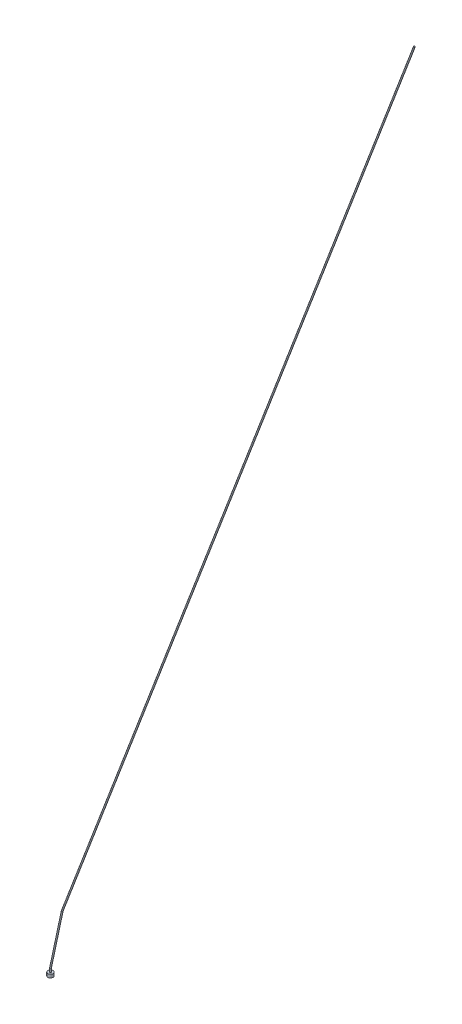
ISO-10303-21;
HEADER;
FILE_DESCRIPTION(('STEP AP214'),'2;1');
FILE_NAME('part.step','',(''),(''),'','','');
FILE_SCHEMA(('AUTOMOTIVE_DESIGN { 1 0 10303 214 1 1 1 1 }'));
ENDSEC;
DATA;
#1=APPLICATION_CONTEXT('core data for automotive mechanical design processes');
#2=APPLICATION_PROTOCOL_DEFINITION('international standard','automotive_design',2000,#1);
#3=PRODUCT_CONTEXT('',#1,'mechanical');
#4=PRODUCT('Part','Part','',(#3));
#5=PRODUCT_RELATED_PRODUCT_CATEGORY('part','',(#4));
#6=PRODUCT_DEFINITION_FORMATION('','',#4);
#7=PRODUCT_DEFINITION_CONTEXT('part definition',#1,'design');
#8=PRODUCT_DEFINITION('design','',#6,#7);
#9=PRODUCT_DEFINITION_SHAPE('','',#8);
#10=(LENGTH_UNIT() NAMED_UNIT(*) SI_UNIT(.MILLI.,.METRE.));
#11=(NAMED_UNIT(*) PLANE_ANGLE_UNIT() SI_UNIT($,.RADIAN.));
#12=(NAMED_UNIT(*) SI_UNIT($,.STERADIAN.) SOLID_ANGLE_UNIT());
#13=UNCERTAINTY_MEASURE_WITH_UNIT(LENGTH_MEASURE(1.E-05),#10,'distance_accuracy_value','');
#14=(GEOMETRIC_REPRESENTATION_CONTEXT(3) GLOBAL_UNCERTAINTY_ASSIGNED_CONTEXT((#13)) GLOBAL_UNIT_ASSIGNED_CONTEXT((#10,
#11,#12)) REPRESENTATION_CONTEXT('',''));
#15=CARTESIAN_POINT('',(0.,0.,0.));
#16=DIRECTION('',(0.,0.,1.));
#17=DIRECTION('',(1.,0.,0.));
#18=AXIS2_PLACEMENT_3D('',#15,#16,#17);
#19=CARTESIAN_POINT('',(55.0000000000001,-42.2848066897179,0.));
#20=DIRECTION('',(0.,-1.,0.));
#21=DIRECTION('',(1.,0.,0.));
#22=AXIS2_PLACEMENT_3D('',#19,#20,#21);
#23=CYLINDRICAL_SURFACE('',#22,0.99999999999998);
#24=CARTESIAN_POINT('',(55.0000000000003,-42.5,0.));
#25=DIRECTION('',(-0.10415165733338,-0.99456142709976,0.));
#26=DIRECTION('',(-0.99456142709976,0.10415165733338,0.));
#27=AXIS2_PLACEMENT_3D('',#24,#25,#26);
#28=ELLIPSE('',#27,1.00546831271758,0.99999999999998);
#29=CARTESIAN_POINT('',(54.0000000000003,-42.3952788088343,0.));
#30=VERTEX_POINT('',#29);
#31=EDGE_CURVE('E66',#30,#30,#28,.F.);
#32=ORIENTED_EDGE('',*,*,#31,.F.);
#33=EDGE_LOOP('',(#32));
#34=FACE_BOUND('',#33,.T.);
#35=CARTESIAN_POINT('',(55.0000000000001,-47.4999999999998,0.));
#36=DIRECTION('',(0.,-1.,0.));
#37=DIRECTION('',(1.,0.,0.));
#38=AXIS2_PLACEMENT_3D('',#35,#36,#37);
#39=CIRCLE('',#38,0.99999999999998);
#40=CARTESIAN_POINT('',(56.0000000000001,-47.4999999999998,0.));
#41=VERTEX_POINT('',#40);
#42=EDGE_CURVE('E53',#41,#41,#39,.F.);
#43=ORIENTED_EDGE('',*,*,#42,.T.);
#44=EDGE_LOOP('',(#43));
#45=FACE_BOUND('',#44,.T.);
#46=ADVANCED_FACE('F49',(#34,#45),#23,.T.);
#47=CARTESIAN_POINT('',(611.965,1457.5,0.));
#48=DIRECTION('',(-0.355947678216296,-0.934505885680999,0.));
#49=DIRECTION('',(0.934505885680999,-0.355947678216297,0.));
#50=AXIS2_PLACEMENT_3D('',#47,#48,#49);
#51=PLANE('',#50);
#52=CARTESIAN_POINT('',(611.965,1457.5,0.));
#53=DIRECTION('',(-0.355947678216296,-0.934505885680999,0.));
#54=DIRECTION('',(0.934505885680999,-0.355947678216297,0.));
#55=AXIS2_PLACEMENT_3D('',#52,#53,#54);
#56=CIRCLE('',#55,0.99999999999998);
#57=CARTESIAN_POINT('',(612.899505885681,1457.14405232178,0.));
#58=VERTEX_POINT('',#57);
#59=EDGE_CURVE('E58',#58,#58,#56,.T.);
#60=ORIENTED_EDGE('',*,*,#59,.F.);
#61=EDGE_LOOP('',(#60));
#62=FACE_BOUND('',#61,.T.);
#63=ADVANCED_FACE('F92',(#62),#51,.F.);
#64=CARTESIAN_POINT('',(73.0414340883812,42.6956609729101,0.));
#65=DIRECTION('',(-0.207170441904583,-0.97830486454942,0.));
#66=DIRECTION('',(0.97830486454942,-0.207170441904583,0.));
#67=AXIS2_PLACEMENT_3D('',#64,#65,#66);
#68=CYLINDRICAL_SURFACE('',#67,0.99999999999998);
#69=CARTESIAN_POINT('',(73.0000000000001,42.5,0.));
#70=DIRECTION('',(-0.282409440245183,-0.959293963319067,0.));
#71=DIRECTION('',(-0.959293963319067,0.282409440245183,0.));
#72=AXIS2_PLACEMENT_3D('',#69,#70,#71);
#73=ELLIPSE('',#72,1.00302025509161,0.99999999999998);
#74=CARTESIAN_POINT('',(72.0378087242039,42.783262388795,0.));
#75=VERTEX_POINT('',#74);
#76=EDGE_CURVE('E11',#75,#75,#73,.F.);
#77=ORIENTED_EDGE('',*,*,#76,.F.);
#78=EDGE_LOOP('',(#77));
#79=FACE_BOUND('',#78,.T.);
#80=ORIENTED_EDGE('',*,*,#31,.T.);
#81=EDGE_LOOP('',(#80));
#82=FACE_BOUND('',#81,.T.);
#83=ADVANCED_FACE('F99',(#79,#82),#68,.T.);
#84=CARTESIAN_POINT('',(611.965,1457.5,0.));
#85=DIRECTION('',(-0.355947678216296,-0.934505885680999,0.));
#86=DIRECTION('',(0.934505885680999,-0.355947678216296,0.));
#87=AXIS2_PLACEMENT_3D('',#84,#85,#86);
#88=CYLINDRICAL_SURFACE('',#87,0.99999999999998);
#89=ORIENTED_EDGE('',*,*,#59,.T.);
#90=EDGE_LOOP('',(#89));
#91=FACE_BOUND('',#90,.T.);
#92=ORIENTED_EDGE('',*,*,#76,.T.);
#93=EDGE_LOOP('',(#92));
#94=FACE_BOUND('',#93,.T.);
#95=ADVANCED_FACE('F90',(#91,#94),#88,.T.);
#96=CARTESIAN_POINT('',(54.9999999999996,-47.4999999999998,0.));
#97=DIRECTION('',(0.,-1.,0.));
#98=DIRECTION('',(1.,0.,0.));
#99=AXIS2_PLACEMENT_3D('',#96,#97,#98);
#100=CYLINDRICAL_SURFACE('',#99,4.);
#101=CARTESIAN_POINT('',(54.9999999999996,-47.4999999999998,0.));
#102=DIRECTION('',(0.,-1.,0.));
#103=DIRECTION('',(1.,0.,0.));
#104=AXIS2_PLACEMENT_3D('',#101,#102,#103);
#105=CIRCLE('',#104,4.);
#106=CARTESIAN_POINT('',(58.9999999999996,-47.4999999999998,0.));
#107=VERTEX_POINT('',#106);
#108=EDGE_CURVE('E75',#107,#107,#105,.T.);
#109=ORIENTED_EDGE('',*,*,#108,.T.);
#110=EDGE_LOOP('',(#109));
#111=FACE_BOUND('',#110,.T.);
#112=CARTESIAN_POINT('',(54.9999999999996,-52.4999999999998,0.));
#113=DIRECTION('',(0.,-1.,0.));
#114=DIRECTION('',(1.,0.,0.));
#115=AXIS2_PLACEMENT_3D('',#112,#113,#114);
#116=CIRCLE('',#115,4.);
#117=CARTESIAN_POINT('',(58.9999999999996,-52.4999999999998,0.));
#118=VERTEX_POINT('',#117);
#119=EDGE_CURVE('E79',#118,#118,#116,.T.);
#120=ORIENTED_EDGE('',*,*,#119,.F.);
#121=EDGE_LOOP('',(#120));
#122=FACE_BOUND('',#121,.T.);
#123=ADVANCED_FACE('F87',(#111,#122),#100,.T.);
#124=CARTESIAN_POINT('',(54.9999999999996,-47.4999999999998,0.));
#125=DIRECTION('',(0.,-1.,0.));
#126=DIRECTION('',(1.,0.,0.));
#127=AXIS2_PLACEMENT_3D('',#124,#125,#126);
#128=PLANE('',#127);
#129=ORIENTED_EDGE('',*,*,#42,.F.);
#130=EDGE_LOOP('',(#129));
#131=FACE_BOUND('',#130,.T.);
#132=ORIENTED_EDGE('',*,*,#108,.F.);
#133=EDGE_LOOP('',(#132));
#134=FACE_BOUND('',#133,.T.);
#135=ADVANCED_FACE('F89',(#131,#134),#128,.F.);
#136=CARTESIAN_POINT('',(55.0000000000001,-52.4999999999998,0.));
#137=DIRECTION('',(0.,-1.,0.));
#138=DIRECTION('',(1.,0.,0.));
#139=AXIS2_PLACEMENT_3D('',#136,#137,#138);
#140=PLANE('',#139);
#141=ORIENTED_EDGE('',*,*,#119,.T.);
#142=EDGE_LOOP('',(#141));
#143=FACE_BOUND('',#142,.T.);
#144=ADVANCED_FACE('F51',(#143),#140,.T.);
#145=CLOSED_SHELL('',(#46,#63,#83,#95,#123,#135,#144));
#146=MANIFOLD_SOLID_BREP('B2',#145);
#147=ADVANCED_BREP_SHAPE_REPRESENTATION('',(#18,#146),#14);
#148=SHAPE_DEFINITION_REPRESENTATION(#9,#147);
ENDSEC;
END-ISO-10303-21;
